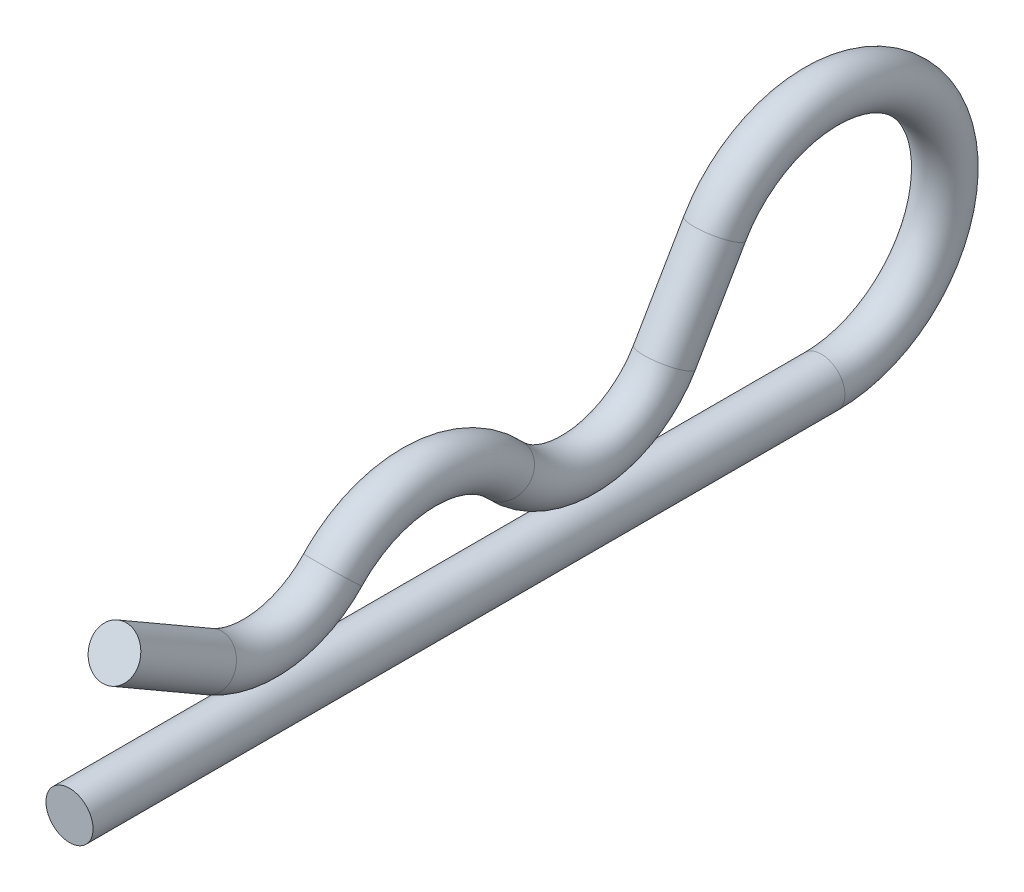
ISO-10303-21;
HEADER;
FILE_DESCRIPTION(('STEP AP214'),'2;1');
FILE_NAME('part.step','',(''),(''),'','','');
FILE_SCHEMA(('AUTOMOTIVE_DESIGN { 1 0 10303 214 1 1 1 1 }'));
ENDSEC;
DATA;
#1=APPLICATION_CONTEXT('core data for automotive mechanical design processes');
#2=APPLICATION_PROTOCOL_DEFINITION('international standard','automotive_design',2000,#1);
#3=PRODUCT_CONTEXT('',#1,'mechanical');
#4=PRODUCT('Part','Part','',(#3));
#5=PRODUCT_RELATED_PRODUCT_CATEGORY('part','',(#4));
#6=PRODUCT_DEFINITION_FORMATION('','',#4);
#7=PRODUCT_DEFINITION_CONTEXT('part definition',#1,'design');
#8=PRODUCT_DEFINITION('design','',#6,#7);
#9=PRODUCT_DEFINITION_SHAPE('','',#8);
#10=(LENGTH_UNIT() NAMED_UNIT(*) SI_UNIT(.MILLI.,.METRE.));
#11=(NAMED_UNIT(*) PLANE_ANGLE_UNIT() SI_UNIT($,.RADIAN.));
#12=(NAMED_UNIT(*) SI_UNIT($,.STERADIAN.) SOLID_ANGLE_UNIT());
#13=UNCERTAINTY_MEASURE_WITH_UNIT(LENGTH_MEASURE(1.E-05),#10,'distance_accuracy_value','');
#14=(GEOMETRIC_REPRESENTATION_CONTEXT(3) GLOBAL_UNCERTAINTY_ASSIGNED_CONTEXT((#13)) GLOBAL_UNIT_ASSIGNED_CONTEXT((#10,
#11,#12)) REPRESENTATION_CONTEXT('',''));
#15=CARTESIAN_POINT('',(0.,0.,0.));
#16=DIRECTION('',(0.,0.,1.));
#17=DIRECTION('',(1.,0.,0.));
#18=AXIS2_PLACEMENT_3D('',#15,#16,#17);
#19=CARTESIAN_POINT('',(0.,0.,11.9507));
#20=DIRECTION('',(0.,0.,1.));
#21=DIRECTION('',(1.,0.,0.));
#22=AXIS2_PLACEMENT_3D('',#19,#20,#21);
#23=PLANE('',#22);
#24=CARTESIAN_POINT('',(0.,0.,11.9507));
#25=DIRECTION('',(0.,0.,1.));
#26=DIRECTION('',(1.,0.,0.));
#27=AXIS2_PLACEMENT_3D('',#24,#25,#26);
#28=CIRCLE('',#27,0.749300000000001);
#29=CARTESIAN_POINT('',(0.749300000000001,0.,11.9507));
#30=VERTEX_POINT('',#29);
#31=EDGE_CURVE('E61',#30,#30,#28,.T.);
#32=ORIENTED_EDGE('',*,*,#31,.T.);
#33=EDGE_LOOP('',(#32));
#34=FACE_BOUND('',#33,.T.);
#35=ADVANCED_FACE('F46',(#34),#23,.T.);
#36=CARTESIAN_POINT('',(0.,3.75432243921098,10.52195));
#37=DIRECTION('',(0.,-0.499999999999994,-0.866025403784442));
#38=DIRECTION('',(1.,0.,0.));
#39=AXIS2_PLACEMENT_3D('',#36,#37,#38);
#40=PLANE('',#39);
#41=CARTESIAN_POINT('',(0.,3.75432243921098,10.52195));
#42=DIRECTION('',(0.,-0.499999999999994,-0.866025403784442));
#43=DIRECTION('',(1.,0.,0.));
#44=AXIS2_PLACEMENT_3D('',#41,#42,#43);
#45=CIRCLE('',#44,0.749300000000001);
#46=CARTESIAN_POINT('',(0.749300000000001,3.75432243921098,10.52195));
#47=VERTEX_POINT('',#46);
#48=EDGE_CURVE('E11',#47,#47,#45,.T.);
#49=ORIENTED_EDGE('',*,*,#48,.F.);
#50=EDGE_LOOP('',(#49));
#51=FACE_BOUND('',#50,.T.);
#52=ADVANCED_FACE('F67',(#51),#40,.F.);
#53=CARTESIAN_POINT('',(0.,0.,11.9507));
#54=DIRECTION('',(0.,0.,-1.));
#55=DIRECTION('',(0.,1.,0.));
#56=AXIS2_PLACEMENT_3D('',#53,#54,#55);
#57=CYLINDRICAL_SURFACE('',#56,0.749300000000001);
#58=CARTESIAN_POINT('',(0.,0.,-11.9507));
#59=DIRECTION('',(0.,0.,1.));
#60=DIRECTION('',(1.,0.,0.));
#61=AXIS2_PLACEMENT_3D('',#58,#59,#60);
#62=CIRCLE('',#61,0.749300000000001);
#63=CARTESIAN_POINT('',(0.,-0.749300000000001,-11.9507));
#64=VERTEX_POINT('',#63);
#65=EDGE_CURVE('E111',#64,#64,#62,.T.);
#66=ORIENTED_EDGE('',*,*,#65,.T.);
#67=EDGE_LOOP('',(#66));
#68=FACE_BOUND('',#67,.T.);
#69=ORIENTED_EDGE('',*,*,#31,.F.);
#70=EDGE_LOOP('',(#69));
#71=FACE_BOUND('',#70,.T.);
#72=ADVANCED_FACE('F69',(#68,#71),#57,.T.);
#73=CARTESIAN_POINT('',(0.,3.9243,-11.9507));
#74=DIRECTION('',(1.,0.,0.));
#75=DIRECTION('',(0.,0.,-1.));
#76=AXIS2_PLACEMENT_3D('',#73,#74,#75);
#77=TOROIDAL_SURFACE('',#76,3.9243,0.749300000000001);
#78=CARTESIAN_POINT('',(0.,5.89707867003682,-8.55831517379768));
#79=DIRECTION('',(0.,0.864456037051785,-0.502708424441766));
#80=DIRECTION('',(1.,0.,0.));
#81=AXIS2_PLACEMENT_3D('',#78,#79,#80);
#82=CIRCLE('',#81,0.749300000000001);
#83=CARTESIAN_POINT('',(0.,6.27375809247103,-7.91057826523478));
#84=VERTEX_POINT('',#83);
#85=EDGE_CURVE('E108',#84,#84,#82,.T.);
#86=CARTESIAN_POINT('',(0.,3.9243,-11.9507));
#87=DIRECTION('',(1.,0.,0.));
#88=DIRECTION('',(0.,0.,-1.));
#89=AXIS2_PLACEMENT_3D('',#86,#87,#88);
#90=CIRCLE('',#89,4.6736);
#91=EDGE_CURVE('',#64,#84,#90,.T.);
#92=ORIENTED_EDGE('',*,*,#65,.F.);
#93=ORIENTED_EDGE('',*,*,#85,.T.);
#94=ORIENTED_EDGE('',*,*,#91,.T.);
#95=ORIENTED_EDGE('',*,*,#91,.F.);
#96=EDGE_LOOP('',(#92,#94,#93,#95));
#97=FACE_BOUND('',#96,.T.);
#98=ADVANCED_FACE('F75',(#97),#77,.T.);
#99=CARTESIAN_POINT('',(0.,5.89707867003682,-8.55831517379768));
#100=DIRECTION('',(0.,-0.864456037051785,0.502708424441766));
#101=DIRECTION('',(0.,-0.502708424441766,-0.864456037051786));
#102=AXIS2_PLACEMENT_3D('',#99,#100,#101);
#103=CYLINDRICAL_SURFACE('',#102,0.749300000000001);
#104=CARTESIAN_POINT('',(0.,3.1524307523974,-6.96221592619507));
#105=DIRECTION('',(0.,0.864456037051785,-0.502708424441766));
#106=DIRECTION('',(1.,0.,0.));
#107=AXIS2_PLACEMENT_3D('',#104,#105,#106);
#108=CIRCLE('',#107,0.749300000000001);
#109=CARTESIAN_POINT('',(0.,2.77575132996318,-7.60995283475798));
#110=VERTEX_POINT('',#109);
#111=EDGE_CURVE('E116',#110,#110,#108,.T.);
#112=ORIENTED_EDGE('',*,*,#111,.T.);
#113=EDGE_LOOP('',(#112));
#114=FACE_BOUND('',#113,.T.);
#115=ORIENTED_EDGE('',*,*,#85,.F.);
#116=EDGE_LOOP('',(#115));
#117=FACE_BOUND('',#116,.T.);
#118=ADVANCED_FACE('F96',(#114,#117),#103,.T.);
#119=CARTESIAN_POINT('',(0.,4.74853,-4.21756800855566));
#120=DIRECTION('',(-1.,0.,0.));
#121=DIRECTION('',(0.,0.,1.));
#122=AXIS2_PLACEMENT_3D('',#119,#120,#121);
#123=TOROIDAL_SURFACE('',#122,3.175,0.749300000000001);
#124=CARTESIAN_POINT('',(0.,2.57488671675004,-1.90328628906204));
#125=DIRECTION('',(0.,-0.728907628186966,-0.684612057716523));
#126=DIRECTION('',(1.,0.,0.));
#127=AXIS2_PLACEMENT_3D('',#124,#125,#126);
#128=CIRCLE('',#127,0.749300000000001);
#129=CARTESIAN_POINT('',(0.,2.06190690190305,-1.35711580326154));
#130=VERTEX_POINT('',#129);
#131=EDGE_CURVE('E123',#130,#130,#128,.T.);
#132=CARTESIAN_POINT('',(0.,4.74853,-4.21756800855566));
#133=DIRECTION('',(-1.,0.,0.));
#134=DIRECTION('',(0.,0.,1.));
#135=AXIS2_PLACEMENT_3D('',#132,#133,#134);
#136=CIRCLE('',#135,3.9243);
#137=EDGE_CURVE('',#110,#130,#136,.T.);
#138=ORIENTED_EDGE('',*,*,#111,.F.);
#139=ORIENTED_EDGE('',*,*,#131,.T.);
#140=ORIENTED_EDGE('',*,*,#137,.T.);
#141=ORIENTED_EDGE('',*,*,#137,.F.);
#142=EDGE_LOOP('',(#138,#140,#139,#141));
#143=FACE_BOUND('',#142,.T.);
#144=ADVANCED_FACE('F92',(#143),#123,.T.);
#145=CARTESIAN_POINT('',(0.,0.,0.838200000000002));
#146=DIRECTION('',(1.,0.,0.));
#147=DIRECTION('',(0.,0.,-1.));
#148=AXIS2_PLACEMENT_3D('',#145,#146,#147);
#149=TOROIDAL_SURFACE('',#148,3.76108876220849,0.749300000000001);
#150=CARTESIAN_POINT('',(0.,2.57488671675004,3.57968628906204));
#151=DIRECTION('',(0.,0.728907628186967,-0.684612057716522));
#152=DIRECTION('',(1.,0.,0.));
#153=AXIS2_PLACEMENT_3D('',#150,#151,#152);
#154=CIRCLE('',#153,0.749300000000001);
#155=CARTESIAN_POINT('',(0.,2.06190690190305,3.03351580326155));
#156=VERTEX_POINT('',#155);
#157=EDGE_CURVE('E127',#156,#156,#154,.T.);
#158=ORIENTED_EDGE('',*,*,#157,.T.);
#159=EDGE_LOOP('',(#158));
#160=FACE_BOUND('',#159,.T.);
#161=ORIENTED_EDGE('',*,*,#131,.F.);
#162=EDGE_LOOP('',(#161));
#163=FACE_BOUND('',#162,.T.);
#164=ADVANCED_FACE('F86',(#160,#163),#149,.T.);
#165=CARTESIAN_POINT('',(0.,4.74853,5.89396800855566));
#166=DIRECTION('',(-1.,0.,0.));
#167=DIRECTION('',(0.,0.,1.));
#168=AXIS2_PLACEMENT_3D('',#165,#166,#167);
#169=TOROIDAL_SURFACE('',#168,3.175,0.749300000000001);
#170=CARTESIAN_POINT('',(0.,1.9988993429844,7.48146800855564));
#171=DIRECTION('',(0.,-0.499999999999994,-0.866025403784442));
#172=DIRECTION('',(1.,0.,0.));
#173=AXIS2_PLACEMENT_3D('',#170,#171,#172);
#174=CIRCLE('',#173,0.749300000000001);
#175=CARTESIAN_POINT('',(0.,1.34998650792871,7.85611800855564));
#176=VERTEX_POINT('',#175);
#177=EDGE_CURVE('E54',#176,#176,#174,.T.);
#178=CARTESIAN_POINT('',(0.,4.74853,5.89396800855566));
#179=DIRECTION('',(-1.,0.,0.));
#180=DIRECTION('',(0.,0.,1.));
#181=AXIS2_PLACEMENT_3D('',#178,#179,#180);
#182=CIRCLE('',#181,3.9243);
#183=EDGE_CURVE('',#156,#176,#182,.T.);
#184=ORIENTED_EDGE('',*,*,#157,.F.);
#185=ORIENTED_EDGE('',*,*,#177,.T.);
#186=ORIENTED_EDGE('',*,*,#183,.T.);
#187=ORIENTED_EDGE('',*,*,#183,.F.);
#188=EDGE_LOOP('',(#184,#186,#185,#187));
#189=FACE_BOUND('',#188,.T.);
#190=ADVANCED_FACE('F82',(#189),#169,.T.);
#191=CARTESIAN_POINT('',(0.,1.99889934298439,7.48146800855564));
#192=DIRECTION('',(0.,0.499999999999994,0.866025403784442));
#193=DIRECTION('',(0.,-0.866025403784442,0.499999999999994));
#194=AXIS2_PLACEMENT_3D('',#191,#192,#193);
#195=CYLINDRICAL_SURFACE('',#194,0.749300000000001);
#196=ORIENTED_EDGE('',*,*,#48,.T.);
#197=EDGE_LOOP('',(#196));
#198=FACE_BOUND('',#197,.T.);
#199=ORIENTED_EDGE('',*,*,#177,.F.);
#200=EDGE_LOOP('',(#199));
#201=FACE_BOUND('',#200,.T.);
#202=ADVANCED_FACE('F64',(#198,#201),#195,.T.);
#203=CLOSED_SHELL('',(#35,#52,#72,#98,#118,#144,#164,#190,#202));
#204=MANIFOLD_SOLID_BREP('B2',#203);
#205=ADVANCED_BREP_SHAPE_REPRESENTATION('',(#18,#204),#14);
#206=SHAPE_DEFINITION_REPRESENTATION(#9,#205);
ENDSEC;
END-ISO-10303-21;
